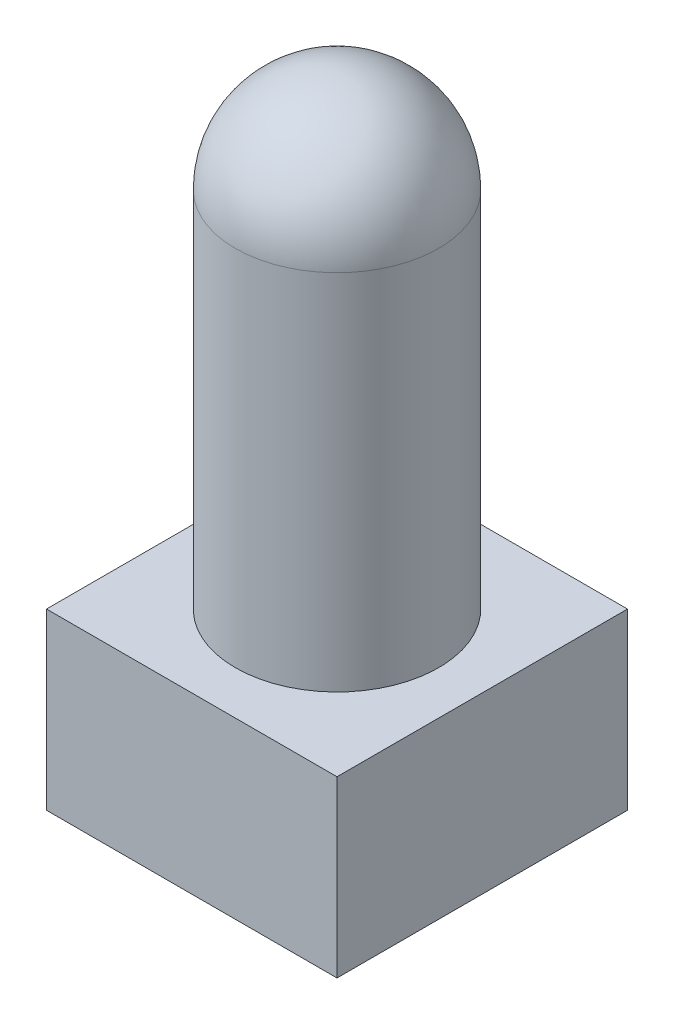
ISO-10303-21;
HEADER;
FILE_DESCRIPTION(('STEP AP214'),'2;1');
FILE_NAME('part.step','',(''),(''),'','','');
FILE_SCHEMA(('AUTOMOTIVE_DESIGN { 1 0 10303 214 1 1 1 1 }'));
ENDSEC;
DATA;
#1=APPLICATION_CONTEXT('core data for automotive mechanical design processes');
#2=APPLICATION_PROTOCOL_DEFINITION('international standard','automotive_design',2000,#1);
#3=PRODUCT_CONTEXT('',#1,'mechanical');
#4=PRODUCT('Part','Part','',(#3));
#5=PRODUCT_RELATED_PRODUCT_CATEGORY('part','',(#4));
#6=PRODUCT_DEFINITION_FORMATION('','',#4);
#7=PRODUCT_DEFINITION_CONTEXT('part definition',#1,'design');
#8=PRODUCT_DEFINITION('design','',#6,#7);
#9=PRODUCT_DEFINITION_SHAPE('','',#8);
#10=(LENGTH_UNIT() NAMED_UNIT(*) SI_UNIT(.MILLI.,.METRE.));
#11=(NAMED_UNIT(*) PLANE_ANGLE_UNIT() SI_UNIT($,.RADIAN.));
#12=(NAMED_UNIT(*) SI_UNIT($,.STERADIAN.) SOLID_ANGLE_UNIT());
#13=UNCERTAINTY_MEASURE_WITH_UNIT(LENGTH_MEASURE(1.E-05),#10,'distance_accuracy_value','');
#14=(GEOMETRIC_REPRESENTATION_CONTEXT(3) GLOBAL_UNCERTAINTY_ASSIGNED_CONTEXT((#13)) GLOBAL_UNIT_ASSIGNED_CONTEXT((#10,
#11,#12)) REPRESENTATION_CONTEXT('',''));
#15=CARTESIAN_POINT('',(0.,0.,0.));
#16=DIRECTION('',(0.,0.,1.));
#17=DIRECTION('',(1.,0.,0.));
#18=AXIS2_PLACEMENT_3D('',#15,#16,#17);
#19=CARTESIAN_POINT('',(0.,11.,0.));
#20=DIRECTION('',(0.,-1.,0.));
#21=DIRECTION('',(0.,0.,-1.));
#22=AXIS2_PLACEMENT_3D('',#19,#20,#21);
#23=CYLINDRICAL_SURFACE('',#22,1.75);
#24=CARTESIAN_POINT('',(0.,3.,0.));
#25=DIRECTION('',(0.,1.,0.));
#26=DIRECTION('',(0.,0.,1.));
#27=AXIS2_PLACEMENT_3D('',#24,#25,#26);
#28=CIRCLE('',#27,1.75);
#29=CARTESIAN_POINT('',(0.,3.,1.75));
#30=VERTEX_POINT('',#29);
#31=EDGE_CURVE('E36',#30,#30,#28,.T.);
#32=ORIENTED_EDGE('',*,*,#31,.T.);
#33=EDGE_LOOP('',(#32));
#34=FACE_BOUND('',#33,.T.);
#35=CARTESIAN_POINT('',(0.,9.25,0.));
#36=DIRECTION('',(0.,-1.,0.));
#37=DIRECTION('',(0.,0.,-1.));
#38=AXIS2_PLACEMENT_3D('',#35,#36,#37);
#39=CIRCLE('',#38,1.75);
#40=CARTESIAN_POINT('',(0.,9.25,-1.75));
#41=VERTEX_POINT('',#40);
#42=EDGE_CURVE('E11',#41,#41,#39,.T.);
#43=ORIENTED_EDGE('',*,*,#42,.T.);
#44=EDGE_LOOP('',(#43));
#45=FACE_BOUND('',#44,.T.);
#46=ADVANCED_FACE('F32',(#34,#45),#23,.T.);
#47=CARTESIAN_POINT('',(0.,9.25,0.));
#48=DIRECTION('',(0.,1.,0.));
#49=DIRECTION('',(0.,0.,1.));
#50=AXIS2_PLACEMENT_3D('',#47,#48,#49);
#51=SPHERICAL_SURFACE('',#50,1.75);
#52=ORIENTED_EDGE('',*,*,#42,.F.);
#53=EDGE_LOOP('',(#52));
#54=FACE_BOUND('',#53,.T.);
#55=ADVANCED_FACE('F34',(#54),#51,.T.);
#56=CARTESIAN_POINT('',(2.5,3.,-2.5));
#57=DIRECTION('',(1.,0.,0.));
#58=DIRECTION('',(0.,0.,-1.));
#59=AXIS2_PLACEMENT_3D('',#56,#57,#58);
#60=PLANE('',#59);
#61=DIRECTION('',(0.,0.,1.));
#62=VECTOR('',#61,1.);
#63=CARTESIAN_POINT('',(2.5,0.,-2.5));
#64=LINE('',#63,#62);
#65=CARTESIAN_POINT('',(2.5,0.,-2.5));
#66=VERTEX_POINT('',#65);
#67=CARTESIAN_POINT('',(2.5,0.,2.5));
#68=VERTEX_POINT('',#67);
#69=EDGE_CURVE('E100',#66,#68,#64,.T.);
#70=ORIENTED_EDGE('',*,*,#69,.F.);
#71=DIRECTION('',(0.,-1.,0.));
#72=VECTOR('',#71,1.);
#73=CARTESIAN_POINT('',(2.5,3.,-2.5));
#74=LINE('',#73,#72);
#75=CARTESIAN_POINT('',(2.5,3.,-2.5));
#76=VERTEX_POINT('',#75);
#77=EDGE_CURVE('E49',#76,#66,#74,.T.);
#78=ORIENTED_EDGE('',*,*,#77,.F.);
#79=DIRECTION('',(0.,0.,1.));
#80=VECTOR('',#79,1.);
#81=CARTESIAN_POINT('',(2.5,3.,-2.5));
#82=LINE('',#81,#80);
#83=CARTESIAN_POINT('',(2.5,3.,2.5));
#84=VERTEX_POINT('',#83);
#85=EDGE_CURVE('E94',#76,#84,#82,.T.);
#86=ORIENTED_EDGE('',*,*,#85,.T.);
#87=DIRECTION('',(0.,-1.,0.));
#88=VECTOR('',#87,1.);
#89=CARTESIAN_POINT('',(2.5,3.,2.5));
#90=LINE('',#89,#88);
#91=EDGE_CURVE('E77',#84,#68,#90,.T.);
#92=ORIENTED_EDGE('',*,*,#91,.T.);
#93=EDGE_LOOP('',(#70,#78,#86,#92));
#94=FACE_BOUND('',#93,.T.);
#95=ADVANCED_FACE('F110',(#94),#60,.T.);
#96=CARTESIAN_POINT('',(-2.5,3.,-2.5));
#97=DIRECTION('',(0.,0.,-1.));
#98=DIRECTION('',(-1.,0.,0.));
#99=AXIS2_PLACEMENT_3D('',#96,#97,#98);
#100=PLANE('',#99);
#101=DIRECTION('',(1.,0.,0.));
#102=VECTOR('',#101,1.);
#103=CARTESIAN_POINT('',(-2.5,0.,-2.5));
#104=LINE('',#103,#102);
#105=CARTESIAN_POINT('',(-2.5,0.,-2.5));
#106=VERTEX_POINT('',#105);
#107=EDGE_CURVE('E96',#106,#66,#104,.T.);
#108=ORIENTED_EDGE('',*,*,#107,.F.);
#109=DIRECTION('',(0.,-1.,0.));
#110=VECTOR('',#109,1.);
#111=CARTESIAN_POINT('',(-2.5,3.,-2.5));
#112=LINE('',#111,#110);
#113=CARTESIAN_POINT('',(-2.5,3.,-2.5));
#114=VERTEX_POINT('',#113);
#115=EDGE_CURVE('E66',#114,#106,#112,.T.);
#116=ORIENTED_EDGE('',*,*,#115,.F.);
#117=DIRECTION('',(1.,0.,0.));
#118=VECTOR('',#117,1.);
#119=CARTESIAN_POINT('',(-2.5,3.,-2.5));
#120=LINE('',#119,#118);
#121=EDGE_CURVE('E91',#114,#76,#120,.T.);
#122=ORIENTED_EDGE('',*,*,#121,.T.);
#123=ORIENTED_EDGE('',*,*,#77,.T.);
#124=EDGE_LOOP('',(#108,#116,#122,#123));
#125=FACE_BOUND('',#124,.T.);
#126=ADVANCED_FACE('F113',(#125),#100,.T.);
#127=CARTESIAN_POINT('',(-2.5,3.,-2.5));
#128=DIRECTION('',(-1.,0.,0.));
#129=DIRECTION('',(0.,0.,1.));
#130=AXIS2_PLACEMENT_3D('',#127,#128,#129);
#131=PLANE('',#130);
#132=DIRECTION('',(0.,0.,-1.));
#133=VECTOR('',#132,1.);
#134=CARTESIAN_POINT('',(-2.5,0.,-2.5));
#135=LINE('',#134,#133);
#136=CARTESIAN_POINT('',(-2.5,0.,2.5));
#137=VERTEX_POINT('',#136);
#138=EDGE_CURVE('E85',#137,#106,#135,.T.);
#139=ORIENTED_EDGE('',*,*,#138,.F.);
#140=DIRECTION('',(0.,-1.,0.));
#141=VECTOR('',#140,1.);
#142=CARTESIAN_POINT('',(-2.5,3.,2.5));
#143=LINE('',#142,#141);
#144=CARTESIAN_POINT('',(-2.5,3.,2.5));
#145=VERTEX_POINT('',#144);
#146=EDGE_CURVE('E80',#145,#137,#143,.T.);
#147=ORIENTED_EDGE('',*,*,#146,.F.);
#148=DIRECTION('',(0.,0.,-1.));
#149=VECTOR('',#148,1.);
#150=CARTESIAN_POINT('',(-2.5,3.,-2.5));
#151=LINE('',#150,#149);
#152=EDGE_CURVE('E83',#145,#114,#151,.T.);
#153=ORIENTED_EDGE('',*,*,#152,.T.);
#154=ORIENTED_EDGE('',*,*,#115,.T.);
#155=EDGE_LOOP('',(#139,#147,#153,#154));
#156=FACE_BOUND('',#155,.T.);
#157=ADVANCED_FACE('F82',(#156),#131,.T.);
#158=CARTESIAN_POINT('',(-2.5,3.,2.5));
#159=DIRECTION('',(0.,0.,1.));
#160=DIRECTION('',(1.,0.,0.));
#161=AXIS2_PLACEMENT_3D('',#158,#159,#160);
#162=PLANE('',#161);
#163=DIRECTION('',(-1.,0.,0.));
#164=VECTOR('',#163,1.);
#165=CARTESIAN_POINT('',(-2.5,0.,2.5));
#166=LINE('',#165,#164);
#167=EDGE_CURVE('E103',#68,#137,#166,.T.);
#168=ORIENTED_EDGE('',*,*,#167,.F.);
#169=ORIENTED_EDGE('',*,*,#91,.F.);
#170=DIRECTION('',(-1.,0.,0.));
#171=VECTOR('',#170,1.);
#172=CARTESIAN_POINT('',(-2.5,3.,2.5));
#173=LINE('',#172,#171);
#174=EDGE_CURVE('E90',#84,#145,#173,.T.);
#175=ORIENTED_EDGE('',*,*,#174,.T.);
#176=ORIENTED_EDGE('',*,*,#146,.T.);
#177=EDGE_LOOP('',(#168,#169,#175,#176));
#178=FACE_BOUND('',#177,.T.);
#179=ADVANCED_FACE('F93',(#178),#162,.T.);
#180=CARTESIAN_POINT('',(0.,3.,0.));
#181=DIRECTION('',(0.,1.,0.));
#182=DIRECTION('',(0.,0.,1.));
#183=AXIS2_PLACEMENT_3D('',#180,#181,#182);
#184=PLANE('',#183);
#185=ORIENTED_EDGE('',*,*,#31,.F.);
#186=EDGE_LOOP('',(#185));
#187=FACE_BOUND('',#186,.T.);
#188=ORIENTED_EDGE('',*,*,#85,.F.);
#189=ORIENTED_EDGE('',*,*,#121,.F.);
#190=ORIENTED_EDGE('',*,*,#152,.F.);
#191=ORIENTED_EDGE('',*,*,#174,.F.);
#192=EDGE_LOOP('',(#188,#189,#190,#191));
#193=FACE_BOUND('',#192,.T.);
#194=ADVANCED_FACE('F89',(#187,#193),#184,.T.);
#195=CARTESIAN_POINT('',(0.,0.,0.));
#196=DIRECTION('',(0.,1.,0.));
#197=DIRECTION('',(0.,0.,1.));
#198=AXIS2_PLACEMENT_3D('',#195,#196,#197);
#199=PLANE('',#198);
#200=ORIENTED_EDGE('',*,*,#69,.T.);
#201=ORIENTED_EDGE('',*,*,#167,.T.);
#202=ORIENTED_EDGE('',*,*,#138,.T.);
#203=ORIENTED_EDGE('',*,*,#107,.T.);
#204=EDGE_LOOP('',(#200,#201,#202,#203));
#205=FACE_BOUND('',#204,.T.);
#206=ADVANCED_FACE('F112',(#205),#199,.F.);
#207=CLOSED_SHELL('',(#46,#55,#95,#126,#157,#179,#194,#206));
#208=MANIFOLD_SOLID_BREP('B2',#207);
#209=ADVANCED_BREP_SHAPE_REPRESENTATION('',(#18,#208),#14);
#210=SHAPE_DEFINITION_REPRESENTATION(#9,#209);
ENDSEC;
END-ISO-10303-21;
